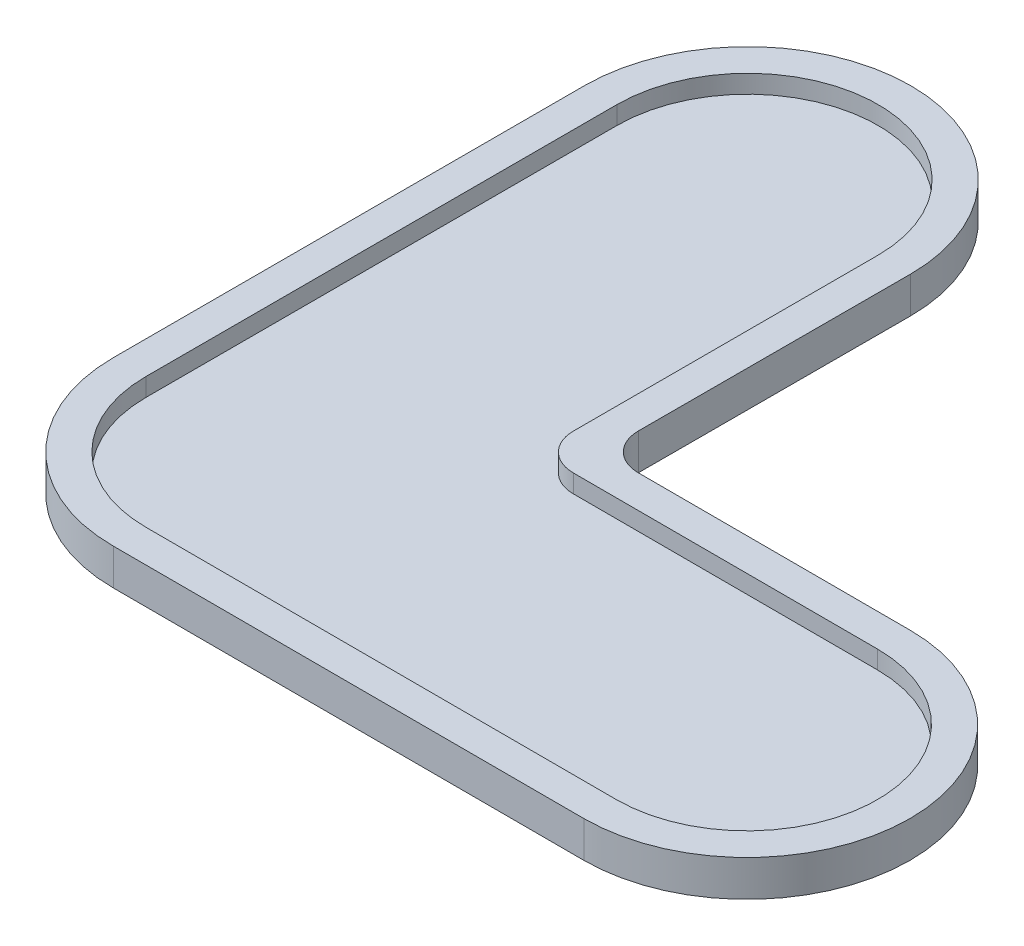
ISO-10303-21;
HEADER;
FILE_DESCRIPTION(('STEP AP214'),'2;1');
FILE_NAME('part.step','',(''),(''),'','','');
FILE_SCHEMA(('AUTOMOTIVE_DESIGN { 1 0 10303 214 1 1 1 1 }'));
ENDSEC;
DATA;
#1=APPLICATION_CONTEXT('core data for automotive mechanical design processes');
#2=APPLICATION_PROTOCOL_DEFINITION('international standard','automotive_design',2000,#1);
#3=PRODUCT_CONTEXT('',#1,'mechanical');
#4=PRODUCT('Part','Part','',(#3));
#5=PRODUCT_RELATED_PRODUCT_CATEGORY('part','',(#4));
#6=PRODUCT_DEFINITION_FORMATION('','',#4);
#7=PRODUCT_DEFINITION_CONTEXT('part definition',#1,'design');
#8=PRODUCT_DEFINITION('design','',#6,#7);
#9=PRODUCT_DEFINITION_SHAPE('','',#8);
#10=(LENGTH_UNIT() NAMED_UNIT(*) SI_UNIT(.MILLI.,.METRE.));
#11=(NAMED_UNIT(*) PLANE_ANGLE_UNIT() SI_UNIT($,.RADIAN.));
#12=(NAMED_UNIT(*) SI_UNIT($,.STERADIAN.) SOLID_ANGLE_UNIT());
#13=UNCERTAINTY_MEASURE_WITH_UNIT(LENGTH_MEASURE(1.E-05),#10,'distance_accuracy_value','');
#14=(GEOMETRIC_REPRESENTATION_CONTEXT(3) GLOBAL_UNCERTAINTY_ASSIGNED_CONTEXT((#13)) GLOBAL_UNIT_ASSIGNED_CONTEXT((#10,
#11,#12)) REPRESENTATION_CONTEXT('',''));
#15=CARTESIAN_POINT('',(0.,0.,0.));
#16=DIRECTION('',(0.,0.,1.));
#17=DIRECTION('',(1.,0.,0.));
#18=AXIS2_PLACEMENT_3D('',#15,#16,#17);
#19=CARTESIAN_POINT('',(0.,10.,0.));
#20=DIRECTION('',(0.,-1.,0.));
#21=DIRECTION('',(0.,0.,-1.));
#22=AXIS2_PLACEMENT_3D('',#19,#20,#21);
#23=CYLINDRICAL_SURFACE('',#22,45.);
#24=CARTESIAN_POINT('',(0.,0.,0.));
#25=DIRECTION('',(0.,1.,0.));
#26=DIRECTION('',(0.,0.,1.));
#27=AXIS2_PLACEMENT_3D('',#24,#25,#26);
#28=CIRCLE('',#27,45.);
#29=CARTESIAN_POINT('',(-45.,0.,0.));
#30=VERTEX_POINT('',#29);
#31=CARTESIAN_POINT('',(0.,0.,45.));
#32=VERTEX_POINT('',#31);
#33=EDGE_CURVE('E387',#30,#32,#28,.T.);
#34=ORIENTED_EDGE('',*,*,#33,.T.);
#35=DIRECTION('',(0.,-1.,0.));
#36=VECTOR('',#35,1.);
#37=CARTESIAN_POINT('',(0.,10.,45.));
#38=LINE('',#37,#36);
#39=CARTESIAN_POINT('',(0.,10.,45.));
#40=VERTEX_POINT('',#39);
#41=EDGE_CURVE('E351',#40,#32,#38,.T.);
#42=ORIENTED_EDGE('',*,*,#41,.F.);
#43=CARTESIAN_POINT('',(0.,10.,0.));
#44=DIRECTION('',(0.,1.,0.));
#45=DIRECTION('',(0.,0.,1.));
#46=AXIS2_PLACEMENT_3D('',#43,#44,#45);
#47=CIRCLE('',#46,45.);
#48=CARTESIAN_POINT('',(-45.,10.,0.));
#49=VERTEX_POINT('',#48);
#50=EDGE_CURVE('E368',#49,#40,#47,.T.);
#51=ORIENTED_EDGE('',*,*,#50,.F.);
#52=DIRECTION('',(0.,-1.,0.));
#53=VECTOR('',#52,1.);
#54=CARTESIAN_POINT('',(-45.,10.,0.));
#55=LINE('',#54,#53);
#56=EDGE_CURVE('E348',#49,#30,#55,.T.);
#57=ORIENTED_EDGE('',*,*,#56,.T.);
#58=EDGE_LOOP('',(#34,#42,#51,#57));
#59=FACE_BOUND('',#58,.T.);
#60=ADVANCED_FACE('F73',(#59),#23,.T.);
#61=CARTESIAN_POINT('',(-0.0630883732670355,10.,44.9999115522075));
#62=DIRECTION('',(0.00140196522816513,0.,-0.999999017246267));
#63=DIRECTION('',(-0.999999017246267,0.,-0.00140196522816513));
#64=AXIS2_PLACEMENT_3D('',#61,#62,#63);
#65=PLANE('',#64);
#66=DIRECTION('',(0.999999017246267,0.,0.00140196522816513));
#67=VECTOR('',#66,1.);
#68=CARTESIAN_POINT('',(-0.0630883732670355,0.,44.9999115522075));
#69=LINE('',#68,#67);
#70=CARTESIAN_POINT('',(130.,0.,45.1822556587739));
#71=VERTEX_POINT('',#70);
#72=EDGE_CURVE('E384',#32,#71,#69,.T.);
#73=ORIENTED_EDGE('',*,*,#72,.T.);
#74=DIRECTION('',(0.,-1.,0.));
#75=VECTOR('',#74,1.);
#76=CARTESIAN_POINT('',(130.,10.,45.1822556587739));
#77=LINE('',#76,#75);
#78=CARTESIAN_POINT('',(130.,10.,45.1822556587739));
#79=VERTEX_POINT('',#78);
#80=EDGE_CURVE('E354',#79,#71,#77,.T.);
#81=ORIENTED_EDGE('',*,*,#80,.F.);
#82=DIRECTION('',(0.999999017246267,0.,0.00140196522816513));
#83=VECTOR('',#82,1.);
#84=CARTESIAN_POINT('',(-0.0630883732670355,10.,44.9999115522075));
#85=LINE('',#84,#83);
#86=EDGE_CURVE('E365',#40,#79,#85,.T.);
#87=ORIENTED_EDGE('',*,*,#86,.F.);
#88=ORIENTED_EDGE('',*,*,#41,.T.);
#89=EDGE_LOOP('',(#73,#81,#87,#88));
#90=FACE_BOUND('',#89,.T.);
#91=ADVANCED_FACE('F432',(#90),#65,.F.);
#92=CARTESIAN_POINT('',(130.,10.,0.182255658773912));
#93=DIRECTION('',(0.,-1.,0.));
#94=DIRECTION('',(0.,0.,-1.));
#95=AXIS2_PLACEMENT_3D('',#92,#93,#94);
#96=CYLINDRICAL_SURFACE('',#95,45.);
#97=CARTESIAN_POINT('',(130.,0.,0.182255658773912));
#98=DIRECTION('',(0.,1.,0.));
#99=DIRECTION('',(0.,0.,1.));
#100=AXIS2_PLACEMENT_3D('',#97,#98,#99);
#101=CIRCLE('',#100,45.);
#102=CARTESIAN_POINT('',(130.,0.,-44.8177443412261));
#103=VERTEX_POINT('',#102);
#104=EDGE_CURVE('E321',#71,#103,#101,.T.);
#105=ORIENTED_EDGE('',*,*,#104,.T.);
#106=CARTESIAN_POINT('',(130.,10.,-44.8177443412261));
#107=DIRECTION('',(0.,-1.,0.));
#108=VECTOR('',#107,1.);
#109=LINE('',#106,#108);
#110=CARTESIAN_POINT('',(130.,10.,-44.8177443412261));
#111=VERTEX_POINT('',#110);
#112=EDGE_CURVE('E358',#111,#103,#109,.T.);
#113=ORIENTED_EDGE('',*,*,#112,.F.);
#114=CARTESIAN_POINT('',(130.,10.,0.182255658773912));
#115=DIRECTION('',(0.,1.,0.));
#116=DIRECTION('',(0.,0.,1.));
#117=AXIS2_PLACEMENT_3D('',#114,#115,#116);
#118=CIRCLE('',#117,45.);
#119=EDGE_CURVE('E362',#79,#111,#118,.T.);
#120=ORIENTED_EDGE('',*,*,#119,.F.);
#121=ORIENTED_EDGE('',*,*,#80,.T.);
#122=EDGE_LOOP('',(#105,#113,#120,#121));
#123=FACE_BOUND('',#122,.T.);
#124=ADVANCED_FACE('F434',(#123),#96,.T.);
#125=CARTESIAN_POINT('',(0.0630883732670451,10.,-44.9999115522075));
#126=DIRECTION('',(0.00140196522816534,0.,-0.999999017246267));
#127=DIRECTION('',(-0.999999017246267,0.,-0.00140196522816534));
#128=AXIS2_PLACEMENT_3D('',#125,#126,#127);
#129=PLANE('',#128);
#130=DIRECTION('',(0.999999017246267,0.,0.00140196522816534));
#131=VECTOR('',#130,1.);
#132=CARTESIAN_POINT('',(0.0630883732670451,0.,-44.9999115522075));
#133=LINE('',#132,#131);
#134=CARTESIAN_POINT('',(54.9119228749143,0.,-44.9230153178607));
#135=VERTEX_POINT('',#134);
#136=EDGE_CURVE('E268',#135,#103,#133,.T.);
#137=ORIENTED_EDGE('',*,*,#136,.F.);
#138=DIRECTION('',(0.,-1.,0.));
#139=VECTOR('',#138,1.);
#140=CARTESIAN_POINT('',(54.9119228749143,10.,-44.9230153178607));
#141=LINE('',#140,#139);
#142=CARTESIAN_POINT('',(54.9119228749143,10.,-44.9230153178607));
#143=VERTEX_POINT('',#142);
#144=EDGE_CURVE('E324',#135,#143,#141,.F.);
#145=ORIENTED_EDGE('',*,*,#144,.T.);
#146=DIRECTION('',(0.999999017246267,0.,0.00140196522816534));
#147=VECTOR('',#146,1.);
#148=CARTESIAN_POINT('',(0.0630883732670451,10.,-44.9999115522075));
#149=LINE('',#148,#147);
#150=EDGE_CURVE('E317',#143,#111,#149,.T.);
#151=ORIENTED_EDGE('',*,*,#150,.T.);
#152=ORIENTED_EDGE('',*,*,#112,.T.);
#153=EDGE_LOOP('',(#137,#145,#151,#152));
#154=FACE_BOUND('',#153,.T.);
#155=ADVANCED_FACE('F441',(#154),#129,.T.);
#156=CARTESIAN_POINT('',(44.871713266272,10.,0.0442652778222172));
#157=DIRECTION('',(0.999999513423901,0.,0.000986484648382328));
#158=DIRECTION('',(0.000986484648382328,0.,-0.999999513423901));
#159=AXIS2_PLACEMENT_3D('',#156,#157,#158);
#160=PLANE('',#159);
#161=DIRECTION('',(-0.000986484648382328,0.,0.999999513423901));
#162=VECTOR('',#161,1.);
#163=CARTESIAN_POINT('',(44.871713266272,10.,0.0442652778222172));
#164=LINE('',#163,#162);
#165=CARTESIAN_POINT('',(45.,10.,-130.));
#166=VERTEX_POINT('',#165);
#167=CARTESIAN_POINT('',(44.9259473929569,10.,-54.9328703368072));
#168=VERTEX_POINT('',#167);
#169=EDGE_CURVE('E314',#166,#168,#164,.T.);
#170=ORIENTED_EDGE('',*,*,#169,.T.);
#171=DIRECTION('',(0.,-1.,0.));
#172=VECTOR('',#171,1.);
#173=CARTESIAN_POINT('',(44.9259473929569,0.,-54.9328703368072));
#174=LINE('',#173,#172);
#175=CARTESIAN_POINT('',(44.9259473929569,0.,-54.9328703368072));
#176=VERTEX_POINT('',#175);
#177=EDGE_CURVE('E328',#168,#176,#174,.T.);
#178=ORIENTED_EDGE('',*,*,#177,.T.);
#179=DIRECTION('',(-0.000986484648382328,0.,0.999999513423901));
#180=VECTOR('',#179,1.);
#181=CARTESIAN_POINT('',(44.871713266272,0.,0.0442652778222172));
#182=LINE('',#181,#180);
#183=CARTESIAN_POINT('',(45.,0.,-130.));
#184=VERTEX_POINT('',#183);
#185=EDGE_CURVE('E399',#184,#176,#182,.T.);
#186=ORIENTED_EDGE('',*,*,#185,.F.);
#187=DIRECTION('',(0.,-1.,0.));
#188=VECTOR('',#187,1.);
#189=CARTESIAN_POINT('',(45.,10.,-130.));
#190=LINE('',#189,#188);
#191=EDGE_CURVE('E343',#166,#184,#190,.T.);
#192=ORIENTED_EDGE('',*,*,#191,.F.);
#193=EDGE_LOOP('',(#170,#178,#186,#192));
#194=FACE_BOUND('',#193,.T.);
#195=ADVANCED_FACE('F457',(#194),#160,.T.);
#196=CARTESIAN_POINT('',(0.,10.,-130.));
#197=DIRECTION('',(0.,-1.,0.));
#198=DIRECTION('',(0.,0.,-1.));
#199=AXIS2_PLACEMENT_3D('',#196,#197,#198);
#200=CYLINDRICAL_SURFACE('',#199,45.);
#201=CARTESIAN_POINT('',(0.,0.,-130.));
#202=DIRECTION('',(0.,1.,0.));
#203=DIRECTION('',(0.,0.,1.));
#204=AXIS2_PLACEMENT_3D('',#201,#202,#203);
#205=CIRCLE('',#204,45.);
#206=CARTESIAN_POINT('',(-45.,0.,-130.));
#207=VERTEX_POINT('',#206);
#208=EDGE_CURVE('E395',#184,#207,#205,.T.);
#209=ORIENTED_EDGE('',*,*,#208,.T.);
#210=DIRECTION('',(0.,-1.,0.));
#211=VECTOR('',#210,1.);
#212=CARTESIAN_POINT('',(-45.,10.,-130.));
#213=LINE('',#212,#211);
#214=CARTESIAN_POINT('',(-45.,10.,-130.));
#215=VERTEX_POINT('',#214);
#216=EDGE_CURVE('E345',#215,#207,#213,.T.);
#217=ORIENTED_EDGE('',*,*,#216,.F.);
#218=CARTESIAN_POINT('',(0.,10.,-130.));
#219=DIRECTION('',(0.,1.,0.));
#220=DIRECTION('',(0.,0.,1.));
#221=AXIS2_PLACEMENT_3D('',#218,#219,#220);
#222=CIRCLE('',#221,45.);
#223=EDGE_CURVE('E376',#166,#215,#222,.T.);
#224=ORIENTED_EDGE('',*,*,#223,.F.);
#225=ORIENTED_EDGE('',*,*,#191,.T.);
#226=EDGE_LOOP('',(#209,#217,#224,#225));
#227=FACE_BOUND('',#226,.T.);
#228=ADVANCED_FACE('F453',(#227),#200,.T.);
#229=CARTESIAN_POINT('',(-45.,10.,0.));
#230=DIRECTION('',(-1.,0.,0.));
#231=DIRECTION('',(0.,0.,1.));
#232=AXIS2_PLACEMENT_3D('',#229,#230,#231);
#233=PLANE('',#232);
#234=DIRECTION('',(0.,0.,-1.));
#235=VECTOR('',#234,1.);
#236=CARTESIAN_POINT('',(-45.,0.,0.));
#237=LINE('',#236,#235);
#238=EDGE_CURVE('E391',#30,#207,#237,.T.);
#239=ORIENTED_EDGE('',*,*,#238,.F.);
#240=ORIENTED_EDGE('',*,*,#56,.F.);
#241=DIRECTION('',(0.,0.,-1.));
#242=VECTOR('',#241,1.);
#243=CARTESIAN_POINT('',(-45.,10.,0.));
#244=LINE('',#243,#242);
#245=EDGE_CURVE('E372',#49,#215,#244,.T.);
#246=ORIENTED_EDGE('',*,*,#245,.T.);
#247=ORIENTED_EDGE('',*,*,#216,.T.);
#248=EDGE_LOOP('',(#239,#240,#246,#247));
#249=FACE_BOUND('',#248,.T.);
#250=ADVANCED_FACE('F449',(#249),#233,.T.);
#251=CARTESIAN_POINT('',(0.,0.,0.));
#252=DIRECTION('',(0.,1.,0.));
#253=DIRECTION('',(0.,0.,1.));
#254=AXIS2_PLACEMENT_3D('',#251,#252,#253);
#255=PLANE('',#254);
#256=ORIENTED_EDGE('',*,*,#72,.F.);
#257=ORIENTED_EDGE('',*,*,#33,.F.);
#258=ORIENTED_EDGE('',*,*,#238,.T.);
#259=ORIENTED_EDGE('',*,*,#208,.F.);
#260=ORIENTED_EDGE('',*,*,#185,.T.);
#261=CARTESIAN_POINT('',(54.9259425271959,0.,-54.9230054903234));
#262=DIRECTION('',(0.,1.,0.));
#263=DIRECTION('',(0.,0.,1.));
#264=AXIS2_PLACEMENT_3D('',#261,#262,#263);
#265=CIRCLE('',#264,10.);
#266=EDGE_CURVE('E327',#176,#135,#265,.T.);
#267=ORIENTED_EDGE('',*,*,#266,.T.);
#268=ORIENTED_EDGE('',*,*,#136,.T.);
#269=ORIENTED_EDGE('',*,*,#104,.F.);
#270=EDGE_LOOP('',(#256,#257,#258,#259,#260,#267,#268,#269));
#271=FACE_BOUND('',#270,.T.);
#272=ADVANCED_FACE('F452',(#271),#255,.F.);
#273=CARTESIAN_POINT('',(0.,10.,0.));
#274=DIRECTION('',(0.,1.,0.));
#275=DIRECTION('',(0.,0.,1.));
#276=AXIS2_PLACEMENT_3D('',#273,#274,#275);
#277=PLANE('',#276);
#278=DIRECTION('',(0.,0.,1.));
#279=VECTOR('',#278,1.);
#280=CARTESIAN_POINT('',(36.,10.,0.));
#281=LINE('',#280,#279);
#282=CARTESIAN_POINT('',(36.,10.,-130.));
#283=VERTEX_POINT('',#282);
#284=CARTESIAN_POINT('',(36.,10.,-45.9355193636732));
#285=VERTEX_POINT('',#284);
#286=EDGE_CURVE('E213',#283,#285,#281,.T.);
#287=ORIENTED_EDGE('',*,*,#286,.T.);
#288=CARTESIAN_POINT('',(46.,10.,-45.9355193636732));
#289=DIRECTION('',(0.,1.,0.));
#290=DIRECTION('',(0.,0.,1.));
#291=AXIS2_PLACEMENT_3D('',#288,#289,#290);
#292=CIRCLE('',#291,10.);
#293=CARTESIAN_POINT('',(45.9859803477184,10.,-35.9355291912105));
#294=VERTEX_POINT('',#293);
#295=EDGE_CURVE('E96',#285,#294,#292,.T.);
#296=ORIENTED_EDGE('',*,*,#295,.T.);
#297=DIRECTION('',(0.999999017246267,0.,0.00140196522816513));
#298=VECTOR('',#297,1.);
#299=CARTESIAN_POINT('',(0.0504706986136284,10.,-35.999929241766));
#300=LINE('',#299,#298);
#301=CARTESIAN_POINT('',(130.,10.,-35.8177443412261));
#302=VERTEX_POINT('',#301);
#303=EDGE_CURVE('E216',#294,#302,#300,.T.);
#304=ORIENTED_EDGE('',*,*,#303,.T.);
#305=CARTESIAN_POINT('',(130.,10.,0.182255658773912));
#306=DIRECTION('',(0.,1.,0.));
#307=DIRECTION('',(0.,0.,1.));
#308=AXIS2_PLACEMENT_3D('',#305,#306,#307);
#309=CIRCLE('',#308,36.);
#310=CARTESIAN_POINT('',(130.,10.,36.1822556587739));
#311=VERTEX_POINT('',#310);
#312=EDGE_CURVE('E257',#311,#302,#309,.T.);
#313=ORIENTED_EDGE('',*,*,#312,.F.);
#314=DIRECTION('',(0.999999017246267,0.,0.00140196522816534));
#315=VECTOR('',#314,1.);
#316=CARTESIAN_POINT('',(-0.0504706986136361,10.,35.999929241766));
#317=LINE('',#316,#315);
#318=CARTESIAN_POINT('',(0.,10.,36.));
#319=VERTEX_POINT('',#318);
#320=EDGE_CURVE('E251',#319,#311,#317,.T.);
#321=ORIENTED_EDGE('',*,*,#320,.F.);
#322=CARTESIAN_POINT('',(0.,10.,0.));
#323=DIRECTION('',(0.,1.,0.));
#324=DIRECTION('',(0.,0.,1.));
#325=AXIS2_PLACEMENT_3D('',#322,#323,#324);
#326=CIRCLE('',#325,36.);
#327=CARTESIAN_POINT('',(-36.,10.,0.));
#328=VERTEX_POINT('',#327);
#329=EDGE_CURVE('E245',#328,#319,#326,.T.);
#330=ORIENTED_EDGE('',*,*,#329,.F.);
#331=DIRECTION('',(0.,0.,-1.));
#332=VECTOR('',#331,1.);
#333=CARTESIAN_POINT('',(-36.,10.,0.));
#334=LINE('',#333,#332);
#335=CARTESIAN_POINT('',(-36.,10.,-130.));
#336=VERTEX_POINT('',#335);
#337=EDGE_CURVE('E242',#328,#336,#334,.T.);
#338=ORIENTED_EDGE('',*,*,#337,.T.);
#339=CARTESIAN_POINT('',(0.,10.,-130.));
#340=DIRECTION('',(0.,1.,0.));
#341=DIRECTION('',(0.,0.,1.));
#342=AXIS2_PLACEMENT_3D('',#339,#340,#341);
#343=CIRCLE('',#342,36.);
#344=EDGE_CURVE('E205',#283,#336,#343,.T.);
#345=ORIENTED_EDGE('',*,*,#344,.F.);
#346=EDGE_LOOP('',(#287,#296,#304,#313,#321,#330,#338,#345));
#347=FACE_BOUND('',#346,.T.);
#348=ORIENTED_EDGE('',*,*,#50,.T.);
#349=ORIENTED_EDGE('',*,*,#86,.T.);
#350=ORIENTED_EDGE('',*,*,#119,.T.);
#351=ORIENTED_EDGE('',*,*,#150,.F.);
#352=CARTESIAN_POINT('',(54.9259425271959,10.,-54.9230054903234));
#353=DIRECTION('',(0.,1.,0.));
#354=DIRECTION('',(0.,0.,1.));
#355=AXIS2_PLACEMENT_3D('',#352,#353,#354);
#356=CIRCLE('',#355,10.);
#357=EDGE_CURVE('E331',#143,#168,#356,.F.);
#358=ORIENTED_EDGE('',*,*,#357,.T.);
#359=ORIENTED_EDGE('',*,*,#169,.F.);
#360=ORIENTED_EDGE('',*,*,#223,.T.);
#361=ORIENTED_EDGE('',*,*,#245,.F.);
#362=EDGE_LOOP('',(#348,#349,#350,#351,#358,#359,#360,#361));
#363=FACE_BOUND('',#362,.T.);
#364=ADVANCED_FACE('F408',(#347,#363),#277,.T.);
#365=CARTESIAN_POINT('',(0.,5.,-130.));
#366=DIRECTION('',(0.,1.,0.));
#367=DIRECTION('',(0.,0.,1.));
#368=AXIS2_PLACEMENT_3D('',#365,#366,#367);
#369=CYLINDRICAL_SURFACE('',#368,36.);
#370=ORIENTED_EDGE('',*,*,#344,.T.);
#371=DIRECTION('',(0.,1.,0.));
#372=VECTOR('',#371,1.);
#373=CARTESIAN_POINT('',(-36.,5.,-130.));
#374=LINE('',#373,#372);
#375=CARTESIAN_POINT('',(-36.,5.,-130.));
#376=VERTEX_POINT('',#375);
#377=EDGE_CURVE('E189',#376,#336,#374,.T.);
#378=ORIENTED_EDGE('',*,*,#377,.F.);
#379=CARTESIAN_POINT('',(0.,5.,-130.));
#380=DIRECTION('',(0.,1.,0.));
#381=DIRECTION('',(0.,0.,1.));
#382=AXIS2_PLACEMENT_3D('',#379,#380,#381);
#383=CIRCLE('',#382,36.);
#384=CARTESIAN_POINT('',(36.,5.,-130.));
#385=VERTEX_POINT('',#384);
#386=EDGE_CURVE('E199',#385,#376,#383,.T.);
#387=ORIENTED_EDGE('',*,*,#386,.F.);
#388=DIRECTION('',(0.,1.,0.));
#389=VECTOR('',#388,1.);
#390=CARTESIAN_POINT('',(36.,5.,-130.));
#391=LINE('',#390,#389);
#392=EDGE_CURVE('E265',#385,#283,#391,.T.);
#393=ORIENTED_EDGE('',*,*,#392,.T.);
#394=EDGE_LOOP('',(#370,#378,#387,#393));
#395=FACE_BOUND('',#394,.T.);
#396=ADVANCED_FACE('F203',(#395),#369,.F.);
#397=CARTESIAN_POINT('',(36.,5.,0.));
#398=DIRECTION('',(-1.,0.,0.));
#399=DIRECTION('',(0.,0.,1.));
#400=AXIS2_PLACEMENT_3D('',#397,#398,#399);
#401=PLANE('',#400);
#402=DIRECTION('',(0.,0.,1.));
#403=VECTOR('',#402,1.);
#404=CARTESIAN_POINT('',(36.,5.,0.));
#405=LINE('',#404,#403);
#406=CARTESIAN_POINT('',(36.,5.,-45.9355193636732));
#407=VERTEX_POINT('',#406);
#408=EDGE_CURVE('E207',#385,#407,#405,.T.);
#409=ORIENTED_EDGE('',*,*,#408,.T.);
#410=DIRECTION('',(0.,1.,0.));
#411=VECTOR('',#410,1.);
#412=CARTESIAN_POINT('',(36.,5.,-45.9355193636732));
#413=LINE('',#412,#411);
#414=EDGE_CURVE('E334',#407,#285,#413,.T.);
#415=ORIENTED_EDGE('',*,*,#414,.T.);
#416=ORIENTED_EDGE('',*,*,#286,.F.);
#417=ORIENTED_EDGE('',*,*,#392,.F.);
#418=EDGE_LOOP('',(#409,#415,#416,#417));
#419=FACE_BOUND('',#418,.T.);
#420=ADVANCED_FACE('F421',(#419),#401,.T.);
#421=CARTESIAN_POINT('',(0.0504706986136284,5.,-35.999929241766));
#422=DIRECTION('',(-0.00140196522816513,0.,0.999999017246267));
#423=DIRECTION('',(0.999999017246267,0.,0.00140196522816513));
#424=AXIS2_PLACEMENT_3D('',#421,#422,#423);
#425=PLANE('',#424);
#426=ORIENTED_EDGE('',*,*,#303,.F.);
#427=DIRECTION('',(0.,1.,0.));
#428=VECTOR('',#427,1.);
#429=CARTESIAN_POINT('',(45.9859803477184,5.,-35.9355291912105));
#430=LINE('',#429,#428);
#431=CARTESIAN_POINT('',(45.9859803477184,5.,-35.9355291912105));
#432=VERTEX_POINT('',#431);
#433=EDGE_CURVE('E82',#294,#432,#430,.F.);
#434=ORIENTED_EDGE('',*,*,#433,.T.);
#435=DIRECTION('',(0.999999017246267,0.,0.00140196522816513));
#436=VECTOR('',#435,1.);
#437=CARTESIAN_POINT('',(0.0504706986136284,5.,-35.999929241766));
#438=LINE('',#437,#436);
#439=CARTESIAN_POINT('',(130.,5.,-35.8177443412261));
#440=VERTEX_POINT('',#439);
#441=EDGE_CURVE('E235',#432,#440,#438,.T.);
#442=ORIENTED_EDGE('',*,*,#441,.T.);
#443=DIRECTION('',(0.,1.,0.));
#444=VECTOR('',#443,1.);
#445=CARTESIAN_POINT('',(130.,5.,-35.8177443412261));
#446=LINE('',#445,#444);
#447=EDGE_CURVE('E269',#440,#302,#446,.T.);
#448=ORIENTED_EDGE('',*,*,#447,.T.);
#449=EDGE_LOOP('',(#426,#434,#442,#448));
#450=FACE_BOUND('',#449,.T.);
#451=ADVANCED_FACE('F417',(#450),#425,.T.);
#452=CARTESIAN_POINT('',(130.,5.,0.182255658773912));
#453=DIRECTION('',(0.,1.,0.));
#454=DIRECTION('',(0.,0.,1.));
#455=AXIS2_PLACEMENT_3D('',#452,#453,#454);
#456=CYLINDRICAL_SURFACE('',#455,36.);
#457=ORIENTED_EDGE('',*,*,#312,.T.);
#458=ORIENTED_EDGE('',*,*,#447,.F.);
#459=CARTESIAN_POINT('',(130.,5.,0.182255658773912));
#460=DIRECTION('',(0.,1.,0.));
#461=DIRECTION('',(0.,0.,1.));
#462=AXIS2_PLACEMENT_3D('',#459,#460,#461);
#463=CIRCLE('',#462,36.);
#464=CARTESIAN_POINT('',(130.,5.,36.1822556587739));
#465=VERTEX_POINT('',#464);
#466=EDGE_CURVE('E229',#465,#440,#463,.T.);
#467=ORIENTED_EDGE('',*,*,#466,.F.);
#468=DIRECTION('',(0.,1.,0.));
#469=VECTOR('',#468,1.);
#470=CARTESIAN_POINT('',(130.,5.,36.1822556587739));
#471=LINE('',#470,#469);
#472=EDGE_CURVE('E273',#465,#311,#471,.T.);
#473=ORIENTED_EDGE('',*,*,#472,.T.);
#474=EDGE_LOOP('',(#457,#458,#467,#473));
#475=FACE_BOUND('',#474,.T.);
#476=ADVANCED_FACE('F416',(#475),#456,.F.);
#477=CARTESIAN_POINT('',(-0.0504706986136361,5.,35.999929241766));
#478=DIRECTION('',(-0.00140196522816534,0.,0.999999017246267));
#479=DIRECTION('',(0.999999017246267,0.,0.00140196522816534));
#480=AXIS2_PLACEMENT_3D('',#477,#478,#479);
#481=PLANE('',#480);
#482=ORIENTED_EDGE('',*,*,#320,.T.);
#483=ORIENTED_EDGE('',*,*,#472,.F.);
#484=DIRECTION('',(0.999999017246267,0.,0.00140196522816534));
#485=VECTOR('',#484,1.);
#486=CARTESIAN_POINT('',(-0.0504706986136361,5.,35.999929241766));
#487=LINE('',#486,#485);
#488=CARTESIAN_POINT('',(0.,5.,36.));
#489=VERTEX_POINT('',#488);
#490=EDGE_CURVE('E223',#489,#465,#487,.T.);
#491=ORIENTED_EDGE('',*,*,#490,.F.);
#492=CARTESIAN_POINT('',(0.,5.,36.));
#493=DIRECTION('',(0.,1.,0.));
#494=VECTOR('',#493,1.);
#495=LINE('',#492,#494);
#496=EDGE_CURVE('E275',#489,#319,#495,.T.);
#497=ORIENTED_EDGE('',*,*,#496,.T.);
#498=EDGE_LOOP('',(#482,#483,#491,#497));
#499=FACE_BOUND('',#498,.T.);
#500=ADVANCED_FACE('F295',(#499),#481,.F.);
#501=CARTESIAN_POINT('',(0.,5.,0.));
#502=DIRECTION('',(0.,1.,0.));
#503=DIRECTION('',(0.,0.,1.));
#504=AXIS2_PLACEMENT_3D('',#501,#502,#503);
#505=CYLINDRICAL_SURFACE('',#504,36.);
#506=ORIENTED_EDGE('',*,*,#329,.T.);
#507=ORIENTED_EDGE('',*,*,#496,.F.);
#508=CARTESIAN_POINT('',(0.,5.,0.));
#509=DIRECTION('',(0.,1.,0.));
#510=DIRECTION('',(0.,0.,1.));
#511=AXIS2_PLACEMENT_3D('',#508,#509,#510);
#512=CIRCLE('',#511,36.);
#513=CARTESIAN_POINT('',(-36.,5.,0.));
#514=VERTEX_POINT('',#513);
#515=EDGE_CURVE('E198',#514,#489,#512,.T.);
#516=ORIENTED_EDGE('',*,*,#515,.F.);
#517=CARTESIAN_POINT('',(-36.,5.,0.));
#518=DIRECTION('',(0.,1.,0.));
#519=VECTOR('',#518,1.);
#520=LINE('',#517,#519);
#521=EDGE_CURVE('E191',#514,#328,#520,.T.);
#522=ORIENTED_EDGE('',*,*,#521,.T.);
#523=EDGE_LOOP('',(#506,#507,#516,#522));
#524=FACE_BOUND('',#523,.T.);
#525=ADVANCED_FACE('F285',(#524),#505,.F.);
#526=CARTESIAN_POINT('',(-36.,5.,0.));
#527=DIRECTION('',(1.,0.,0.));
#528=DIRECTION('',(0.,0.,-1.));
#529=AXIS2_PLACEMENT_3D('',#526,#527,#528);
#530=PLANE('',#529);
#531=ORIENTED_EDGE('',*,*,#337,.F.);
#532=ORIENTED_EDGE('',*,*,#521,.F.);
#533=DIRECTION('',(0.,0.,-1.));
#534=VECTOR('',#533,1.);
#535=CARTESIAN_POINT('',(-36.,5.,0.));
#536=LINE('',#535,#534);
#537=EDGE_CURVE('E185',#514,#376,#536,.T.);
#538=ORIENTED_EDGE('',*,*,#537,.T.);
#539=ORIENTED_EDGE('',*,*,#377,.T.);
#540=EDGE_LOOP('',(#531,#532,#538,#539));
#541=FACE_BOUND('',#540,.T.);
#542=ADVANCED_FACE('F188',(#541),#530,.T.);
#543=CARTESIAN_POINT('',(0.,5.,0.));
#544=DIRECTION('',(0.,1.,0.));
#545=DIRECTION('',(0.,0.,1.));
#546=AXIS2_PLACEMENT_3D('',#543,#544,#545);
#547=PLANE('',#546);
#548=ORIENTED_EDGE('',*,*,#386,.T.);
#549=ORIENTED_EDGE('',*,*,#537,.F.);
#550=ORIENTED_EDGE('',*,*,#515,.T.);
#551=ORIENTED_EDGE('',*,*,#490,.T.);
#552=ORIENTED_EDGE('',*,*,#466,.T.);
#553=ORIENTED_EDGE('',*,*,#441,.F.);
#554=CARTESIAN_POINT('',(46.,5.,-45.9355193636732));
#555=DIRECTION('',(0.,1.,0.));
#556=DIRECTION('',(0.,0.,1.));
#557=AXIS2_PLACEMENT_3D('',#554,#555,#556);
#558=CIRCLE('',#557,10.);
#559=EDGE_CURVE('E12',#432,#407,#558,.F.);
#560=ORIENTED_EDGE('',*,*,#559,.T.);
#561=ORIENTED_EDGE('',*,*,#408,.F.);
#562=EDGE_LOOP('',(#548,#549,#550,#551,#552,#553,#560,#561));
#563=FACE_BOUND('',#562,.T.);
#564=ADVANCED_FACE('F210',(#563),#547,.T.);
#565=CARTESIAN_POINT('',(54.9259425271959,10.,-54.9230054903234));
#566=DIRECTION('',(0.,1.,0.));
#567=DIRECTION('',(0.,0.,1.));
#568=AXIS2_PLACEMENT_3D('',#565,#566,#567);
#569=CYLINDRICAL_SURFACE('',#568,10.);
#570=ORIENTED_EDGE('',*,*,#357,.F.);
#571=ORIENTED_EDGE('',*,*,#144,.F.);
#572=ORIENTED_EDGE('',*,*,#266,.F.);
#573=ORIENTED_EDGE('',*,*,#177,.F.);
#574=EDGE_LOOP('',(#570,#571,#572,#573));
#575=FACE_BOUND('',#574,.T.);
#576=ADVANCED_FACE('F465',(#575),#569,.F.);
#577=CARTESIAN_POINT('',(46.,5.,-45.9355193636732));
#578=DIRECTION('',(0.,1.,0.));
#579=DIRECTION('',(0.,0.,1.));
#580=AXIS2_PLACEMENT_3D('',#577,#578,#579);
#581=CYLINDRICAL_SURFACE('',#580,10.);
#582=ORIENTED_EDGE('',*,*,#559,.F.);
#583=ORIENTED_EDGE('',*,*,#433,.F.);
#584=ORIENTED_EDGE('',*,*,#295,.F.);
#585=ORIENTED_EDGE('',*,*,#414,.F.);
#586=EDGE_LOOP('',(#582,#583,#584,#585));
#587=FACE_BOUND('',#586,.T.);
#588=ADVANCED_FACE('F75',(#587),#581,.T.);
#589=CLOSED_SHELL('',(#60,#91,#124,#155,#195,#228,#250,#272,#364,#396,#420,#451,#476,#500,#525,
#542,#564,#576,#588));
#590=MANIFOLD_SOLID_BREP('B2',#589);
#591=ADVANCED_BREP_SHAPE_REPRESENTATION('',(#18,#590),#14);
#592=SHAPE_DEFINITION_REPRESENTATION(#9,#591);
ENDSEC;
END-ISO-10303-21;
